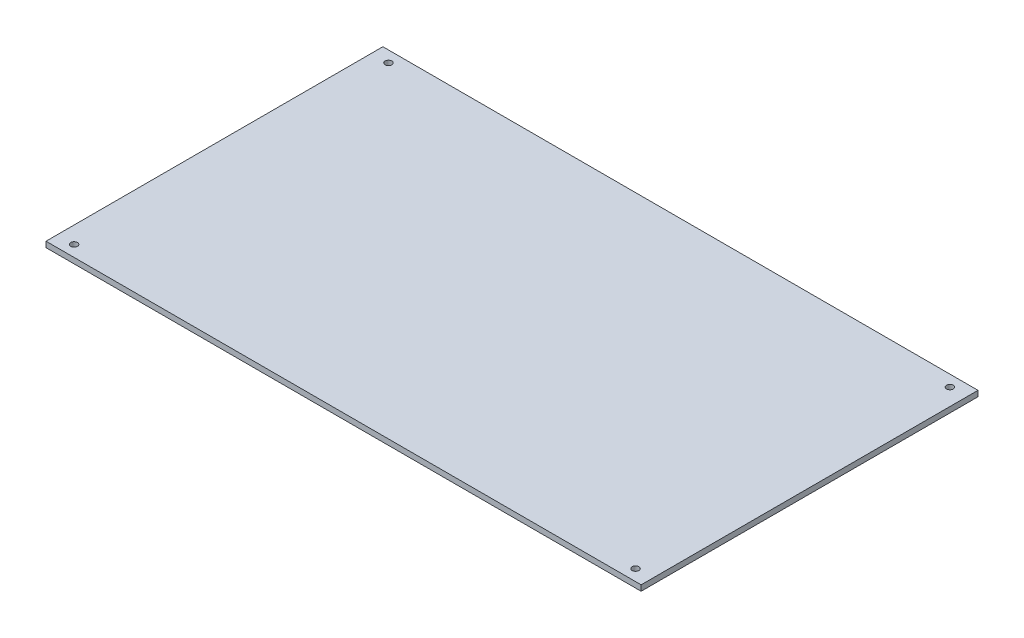
ISO-10303-21;
HEADER;
FILE_DESCRIPTION(('STEP AP214'),'2;1');
FILE_NAME('part.step','',(''),(''),'','','');
FILE_SCHEMA(('AUTOMOTIVE_DESIGN { 1 0 10303 214 1 1 1 1 }'));
ENDSEC;
DATA;
#1=APPLICATION_CONTEXT('core data for automotive mechanical design processes');
#2=APPLICATION_PROTOCOL_DEFINITION('international standard','automotive_design',2000,#1);
#3=PRODUCT_CONTEXT('',#1,'mechanical');
#4=PRODUCT('Part','Part','',(#3));
#5=PRODUCT_RELATED_PRODUCT_CATEGORY('part','',(#4));
#6=PRODUCT_DEFINITION_FORMATION('','',#4);
#7=PRODUCT_DEFINITION_CONTEXT('part definition',#1,'design');
#8=PRODUCT_DEFINITION('design','',#6,#7);
#9=PRODUCT_DEFINITION_SHAPE('','',#8);
#10=(LENGTH_UNIT() NAMED_UNIT(*) SI_UNIT(.MILLI.,.METRE.));
#11=(NAMED_UNIT(*) PLANE_ANGLE_UNIT() SI_UNIT($,.RADIAN.));
#12=(NAMED_UNIT(*) SI_UNIT($,.STERADIAN.) SOLID_ANGLE_UNIT());
#13=UNCERTAINTY_MEASURE_WITH_UNIT(LENGTH_MEASURE(1.E-05),#10,'distance_accuracy_value','');
#14=(GEOMETRIC_REPRESENTATION_CONTEXT(3) GLOBAL_UNCERTAINTY_ASSIGNED_CONTEXT((#13)) GLOBAL_UNIT_ASSIGNED_CONTEXT((#10,
#11,#12)) REPRESENTATION_CONTEXT('',''));
#15=CARTESIAN_POINT('',(0.,0.,0.));
#16=DIRECTION('',(0.,0.,1.));
#17=DIRECTION('',(1.,0.,0.));
#18=AXIS2_PLACEMENT_3D('',#15,#16,#17);
#19=CARTESIAN_POINT('',(-530.,10.,300.));
#20=DIRECTION('',(1.,0.,0.));
#21=DIRECTION('',(0.,0.,-1.));
#22=AXIS2_PLACEMENT_3D('',#19,#20,#21);
#23=PLANE('',#22);
#24=DIRECTION('',(0.,0.,1.));
#25=VECTOR('',#24,1.);
#26=CARTESIAN_POINT('',(-530.,0.,300.));
#27=LINE('',#26,#25);
#28=CARTESIAN_POINT('',(-530.,0.,-300.));
#29=VERTEX_POINT('',#28);
#30=CARTESIAN_POINT('',(-530.,0.,300.));
#31=VERTEX_POINT('',#30);
#32=EDGE_CURVE('E93',#29,#31,#27,.T.);
#33=ORIENTED_EDGE('',*,*,#32,.T.);
#34=DIRECTION('',(0.,-1.,0.));
#35=VECTOR('',#34,1.);
#36=CARTESIAN_POINT('',(-530.,10.,300.));
#37=LINE('',#36,#35);
#38=CARTESIAN_POINT('',(-530.,10.,300.));
#39=VERTEX_POINT('',#38);
#40=EDGE_CURVE('E11',#39,#31,#37,.T.);
#41=ORIENTED_EDGE('',*,*,#40,.F.);
#42=DIRECTION('',(0.,0.,1.));
#43=VECTOR('',#42,1.);
#44=CARTESIAN_POINT('',(-530.,10.,300.));
#45=LINE('',#44,#43);
#46=CARTESIAN_POINT('',(-530.,10.,-300.));
#47=VERTEX_POINT('',#46);
#48=EDGE_CURVE('E81',#47,#39,#45,.T.);
#49=ORIENTED_EDGE('',*,*,#48,.F.);
#50=DIRECTION('',(0.,-1.,0.));
#51=VECTOR('',#50,1.);
#52=CARTESIAN_POINT('',(-530.,10.,-300.));
#53=LINE('',#52,#51);
#54=EDGE_CURVE('E89',#47,#29,#53,.T.);
#55=ORIENTED_EDGE('',*,*,#54,.T.);
#56=EDGE_LOOP('',(#33,#41,#49,#55));
#57=FACE_BOUND('',#56,.T.);
#58=ADVANCED_FACE('F30',(#57),#23,.F.);
#59=CARTESIAN_POINT('',(530.,10.,300.));
#60=DIRECTION('',(0.,0.,-1.));
#61=DIRECTION('',(-1.,0.,0.));
#62=AXIS2_PLACEMENT_3D('',#59,#60,#61);
#63=PLANE('',#62);
#64=DIRECTION('',(1.,0.,0.));
#65=VECTOR('',#64,1.);
#66=CARTESIAN_POINT('',(530.,0.,300.));
#67=LINE('',#66,#65);
#68=CARTESIAN_POINT('',(530.,0.,300.));
#69=VERTEX_POINT('',#68);
#70=EDGE_CURVE('E85',#31,#69,#67,.T.);
#71=ORIENTED_EDGE('',*,*,#70,.T.);
#72=DIRECTION('',(0.,-1.,0.));
#73=VECTOR('',#72,1.);
#74=CARTESIAN_POINT('',(530.,10.,300.));
#75=LINE('',#74,#73);
#76=CARTESIAN_POINT('',(530.,10.,300.));
#77=VERTEX_POINT('',#76);
#78=EDGE_CURVE('E38',#77,#69,#75,.T.);
#79=ORIENTED_EDGE('',*,*,#78,.F.);
#80=DIRECTION('',(1.,0.,0.));
#81=VECTOR('',#80,1.);
#82=CARTESIAN_POINT('',(530.,10.,300.));
#83=LINE('',#82,#81);
#84=EDGE_CURVE('E76',#39,#77,#83,.T.);
#85=ORIENTED_EDGE('',*,*,#84,.F.);
#86=ORIENTED_EDGE('',*,*,#40,.T.);
#87=EDGE_LOOP('',(#71,#79,#85,#86));
#88=FACE_BOUND('',#87,.T.);
#89=ADVANCED_FACE('F84',(#88),#63,.F.);
#90=CARTESIAN_POINT('',(530.,10.,300.));
#91=DIRECTION('',(-1.,0.,0.));
#92=DIRECTION('',(0.,0.,1.));
#93=AXIS2_PLACEMENT_3D('',#90,#91,#92);
#94=PLANE('',#93);
#95=DIRECTION('',(0.,0.,-1.));
#96=VECTOR('',#95,1.);
#97=CARTESIAN_POINT('',(530.,0.,300.));
#98=LINE('',#97,#96);
#99=CARTESIAN_POINT('',(530.,0.,-300.));
#100=VERTEX_POINT('',#99);
#101=EDGE_CURVE('E63',#69,#100,#98,.T.);
#102=ORIENTED_EDGE('',*,*,#101,.T.);
#103=DIRECTION('',(0.,-1.,0.));
#104=VECTOR('',#103,1.);
#105=CARTESIAN_POINT('',(530.,10.,-300.));
#106=LINE('',#105,#104);
#107=CARTESIAN_POINT('',(530.,10.,-300.));
#108=VERTEX_POINT('',#107);
#109=EDGE_CURVE('E86',#108,#100,#106,.T.);
#110=ORIENTED_EDGE('',*,*,#109,.F.);
#111=DIRECTION('',(0.,0.,-1.));
#112=VECTOR('',#111,1.);
#113=CARTESIAN_POINT('',(530.,10.,300.));
#114=LINE('',#113,#112);
#115=EDGE_CURVE('E79',#77,#108,#114,.T.);
#116=ORIENTED_EDGE('',*,*,#115,.F.);
#117=ORIENTED_EDGE('',*,*,#78,.T.);
#118=EDGE_LOOP('',(#102,#110,#116,#117));
#119=FACE_BOUND('',#118,.T.);
#120=ADVANCED_FACE('F87',(#119),#94,.F.);
#121=CARTESIAN_POINT('',(530.,10.,-300.));
#122=DIRECTION('',(0.,0.,1.));
#123=DIRECTION('',(1.,0.,0.));
#124=AXIS2_PLACEMENT_3D('',#121,#122,#123);
#125=PLANE('',#124);
#126=DIRECTION('',(-1.,0.,0.));
#127=VECTOR('',#126,1.);
#128=CARTESIAN_POINT('',(530.,0.,-300.));
#129=LINE('',#128,#127);
#130=EDGE_CURVE('E69',#100,#29,#129,.T.);
#131=ORIENTED_EDGE('',*,*,#130,.T.);
#132=ORIENTED_EDGE('',*,*,#54,.F.);
#133=DIRECTION('',(-1.,0.,0.));
#134=VECTOR('',#133,1.);
#135=CARTESIAN_POINT('',(530.,10.,-300.));
#136=LINE('',#135,#134);
#137=EDGE_CURVE('E46',#108,#47,#136,.T.);
#138=ORIENTED_EDGE('',*,*,#137,.F.);
#139=ORIENTED_EDGE('',*,*,#109,.T.);
#140=EDGE_LOOP('',(#131,#132,#138,#139));
#141=FACE_BOUND('',#140,.T.);
#142=ADVANCED_FACE('F101',(#141),#125,.F.);
#143=CARTESIAN_POINT('',(-530.,10.,-300.));
#144=DIRECTION('',(0.,1.,0.));
#145=DIRECTION('',(0.,0.,1.));
#146=AXIS2_PLACEMENT_3D('',#143,#144,#145);
#147=PLANE('',#146);
#148=CARTESIAN_POINT('',(-500.,10.,280.));
#149=DIRECTION('',(0.,1.,0.));
#150=DIRECTION('',(0.,0.,-1.));
#151=AXIS2_PLACEMENT_3D('',#148,#149,#150);
#152=CIRCLE('',#151,5.99999999999999);
#153=CARTESIAN_POINT('',(-500.,10.,274.));
#154=VERTEX_POINT('',#153);
#155=EDGE_CURVE('E125',#154,#154,#152,.T.);
#156=ORIENTED_EDGE('',*,*,#155,.F.);
#157=EDGE_LOOP('',(#156));
#158=FACE_BOUND('',#157,.T.);
#159=CARTESIAN_POINT('',(500.,10.,280.));
#160=DIRECTION('',(0.,1.,0.));
#161=DIRECTION('',(0.,0.,1.));
#162=AXIS2_PLACEMENT_3D('',#159,#160,#161);
#163=CIRCLE('',#162,5.99999999999994);
#164=CARTESIAN_POINT('',(500.,10.,286.));
#165=VERTEX_POINT('',#164);
#166=EDGE_CURVE('E119',#165,#165,#163,.T.);
#167=ORIENTED_EDGE('',*,*,#166,.F.);
#168=EDGE_LOOP('',(#167));
#169=FACE_BOUND('',#168,.T.);
#170=CARTESIAN_POINT('',(500.,10.,-280.));
#171=DIRECTION('',(0.,1.,0.));
#172=DIRECTION('',(0.,0.,-1.));
#173=AXIS2_PLACEMENT_3D('',#170,#171,#172);
#174=CIRCLE('',#173,5.99999999999994);
#175=CARTESIAN_POINT('',(500.,10.,-286.));
#176=VERTEX_POINT('',#175);
#177=EDGE_CURVE('E113',#176,#176,#174,.T.);
#178=ORIENTED_EDGE('',*,*,#177,.F.);
#179=EDGE_LOOP('',(#178));
#180=FACE_BOUND('',#179,.T.);
#181=CARTESIAN_POINT('',(-500.,10.,-280.));
#182=DIRECTION('',(0.,1.,0.));
#183=DIRECTION('',(0.,0.,1.));
#184=AXIS2_PLACEMENT_3D('',#181,#182,#183);
#185=CIRCLE('',#184,5.99999999999999);
#186=CARTESIAN_POINT('',(-500.,10.,-274.));
#187=VERTEX_POINT('',#186);
#188=EDGE_CURVE('E107',#187,#187,#185,.T.);
#189=ORIENTED_EDGE('',*,*,#188,.F.);
#190=EDGE_LOOP('',(#189));
#191=FACE_BOUND('',#190,.T.);
#192=ORIENTED_EDGE('',*,*,#48,.T.);
#193=ORIENTED_EDGE('',*,*,#84,.T.);
#194=ORIENTED_EDGE('',*,*,#115,.T.);
#195=ORIENTED_EDGE('',*,*,#137,.T.);
#196=EDGE_LOOP('',(#192,#193,#194,#195));
#197=FACE_BOUND('',#196,.T.);
#198=ADVANCED_FACE('F77',(#158,#169,#180,#191,#197),#147,.T.);
#199=CARTESIAN_POINT('',(-530.,0.,-300.));
#200=DIRECTION('',(0.,1.,0.));
#201=DIRECTION('',(0.,0.,1.));
#202=AXIS2_PLACEMENT_3D('',#199,#200,#201);
#203=PLANE('',#202);
#204=CARTESIAN_POINT('',(-500.,0.,280.));
#205=DIRECTION('',(0.,1.,0.));
#206=DIRECTION('',(0.,0.,-1.));
#207=AXIS2_PLACEMENT_3D('',#204,#205,#206);
#208=CIRCLE('',#207,5.99999999999999);
#209=CARTESIAN_POINT('',(-500.,0.,274.));
#210=VERTEX_POINT('',#209);
#211=EDGE_CURVE('E122',#210,#210,#208,.T.);
#212=ORIENTED_EDGE('',*,*,#211,.T.);
#213=EDGE_LOOP('',(#212));
#214=FACE_BOUND('',#213,.T.);
#215=CARTESIAN_POINT('',(500.,0.,280.));
#216=DIRECTION('',(0.,1.,0.));
#217=DIRECTION('',(0.,0.,1.));
#218=AXIS2_PLACEMENT_3D('',#215,#216,#217);
#219=CIRCLE('',#218,5.99999999999994);
#220=CARTESIAN_POINT('',(500.,0.,286.));
#221=VERTEX_POINT('',#220);
#222=EDGE_CURVE('E116',#221,#221,#219,.T.);
#223=ORIENTED_EDGE('',*,*,#222,.T.);
#224=EDGE_LOOP('',(#223));
#225=FACE_BOUND('',#224,.T.);
#226=CARTESIAN_POINT('',(500.,0.,-280.));
#227=DIRECTION('',(0.,1.,0.));
#228=DIRECTION('',(0.,0.,-1.));
#229=AXIS2_PLACEMENT_3D('',#226,#227,#228);
#230=CIRCLE('',#229,5.99999999999994);
#231=CARTESIAN_POINT('',(500.,0.,-286.));
#232=VERTEX_POINT('',#231);
#233=EDGE_CURVE('E110',#232,#232,#230,.T.);
#234=ORIENTED_EDGE('',*,*,#233,.T.);
#235=EDGE_LOOP('',(#234));
#236=FACE_BOUND('',#235,.T.);
#237=CARTESIAN_POINT('',(-500.,0.,-280.));
#238=DIRECTION('',(0.,1.,0.));
#239=DIRECTION('',(0.,0.,1.));
#240=AXIS2_PLACEMENT_3D('',#237,#238,#239);
#241=CIRCLE('',#240,5.99999999999999);
#242=CARTESIAN_POINT('',(-500.,0.,-274.));
#243=VERTEX_POINT('',#242);
#244=EDGE_CURVE('E96',#243,#243,#241,.T.);
#245=ORIENTED_EDGE('',*,*,#244,.T.);
#246=EDGE_LOOP('',(#245));
#247=FACE_BOUND('',#246,.T.);
#248=ORIENTED_EDGE('',*,*,#32,.F.);
#249=ORIENTED_EDGE('',*,*,#130,.F.);
#250=ORIENTED_EDGE('',*,*,#101,.F.);
#251=ORIENTED_EDGE('',*,*,#70,.F.);
#252=EDGE_LOOP('',(#248,#249,#250,#251));
#253=FACE_BOUND('',#252,.T.);
#254=ADVANCED_FACE('F104',(#214,#225,#236,#247,#253),#203,.F.);
#255=CARTESIAN_POINT('',(-500.,0.,-280.));
#256=DIRECTION('',(0.,1.,0.));
#257=DIRECTION('',(0.,0.,1.));
#258=AXIS2_PLACEMENT_3D('',#255,#256,#257);
#259=CYLINDRICAL_SURFACE('',#258,5.99999999999999);
#260=ORIENTED_EDGE('',*,*,#244,.F.);
#261=EDGE_LOOP('',(#260));
#262=FACE_BOUND('',#261,.T.);
#263=ORIENTED_EDGE('',*,*,#188,.T.);
#264=EDGE_LOOP('',(#263));
#265=FACE_BOUND('',#264,.T.);
#266=ADVANCED_FACE('F149',(#262,#265),#259,.F.);
#267=CARTESIAN_POINT('',(500.,0.,-280.));
#268=DIRECTION('',(0.,1.,0.));
#269=DIRECTION('',(0.,0.,1.));
#270=AXIS2_PLACEMENT_3D('',#267,#268,#269);
#271=CYLINDRICAL_SURFACE('',#270,5.99999999999994);
#272=ORIENTED_EDGE('',*,*,#233,.F.);
#273=EDGE_LOOP('',(#272));
#274=FACE_BOUND('',#273,.T.);
#275=ORIENTED_EDGE('',*,*,#177,.T.);
#276=EDGE_LOOP('',(#275));
#277=FACE_BOUND('',#276,.T.);
#278=ADVANCED_FACE('F151',(#274,#277),#271,.F.);
#279=CARTESIAN_POINT('',(500.,0.,280.));
#280=DIRECTION('',(0.,1.,0.));
#281=DIRECTION('',(0.,0.,1.));
#282=AXIS2_PLACEMENT_3D('',#279,#280,#281);
#283=CYLINDRICAL_SURFACE('',#282,5.99999999999994);
#284=ORIENTED_EDGE('',*,*,#222,.F.);
#285=EDGE_LOOP('',(#284));
#286=FACE_BOUND('',#285,.T.);
#287=ORIENTED_EDGE('',*,*,#166,.T.);
#288=EDGE_LOOP('',(#287));
#289=FACE_BOUND('',#288,.T.);
#290=ADVANCED_FACE('F136',(#286,#289),#283,.F.);
#291=CARTESIAN_POINT('',(-500.,0.,280.));
#292=DIRECTION('',(0.,1.,0.));
#293=DIRECTION('',(0.,0.,1.));
#294=AXIS2_PLACEMENT_3D('',#291,#292,#293);
#295=CYLINDRICAL_SURFACE('',#294,5.99999999999999);
#296=ORIENTED_EDGE('',*,*,#211,.F.);
#297=EDGE_LOOP('',(#296));
#298=FACE_BOUND('',#297,.T.);
#299=ORIENTED_EDGE('',*,*,#155,.T.);
#300=EDGE_LOOP('',(#299));
#301=FACE_BOUND('',#300,.T.);
#302=ADVANCED_FACE('F133',(#298,#301),#295,.F.);
#303=CLOSED_SHELL('',(#58,#89,#120,#142,#198,#254,#266,#278,#290,#302));
#304=MANIFOLD_SOLID_BREP('B2',#303);
#305=ADVANCED_BREP_SHAPE_REPRESENTATION('',(#18,#304),#14);
#306=SHAPE_DEFINITION_REPRESENTATION(#9,#305);
ENDSEC;
END-ISO-10303-21;
